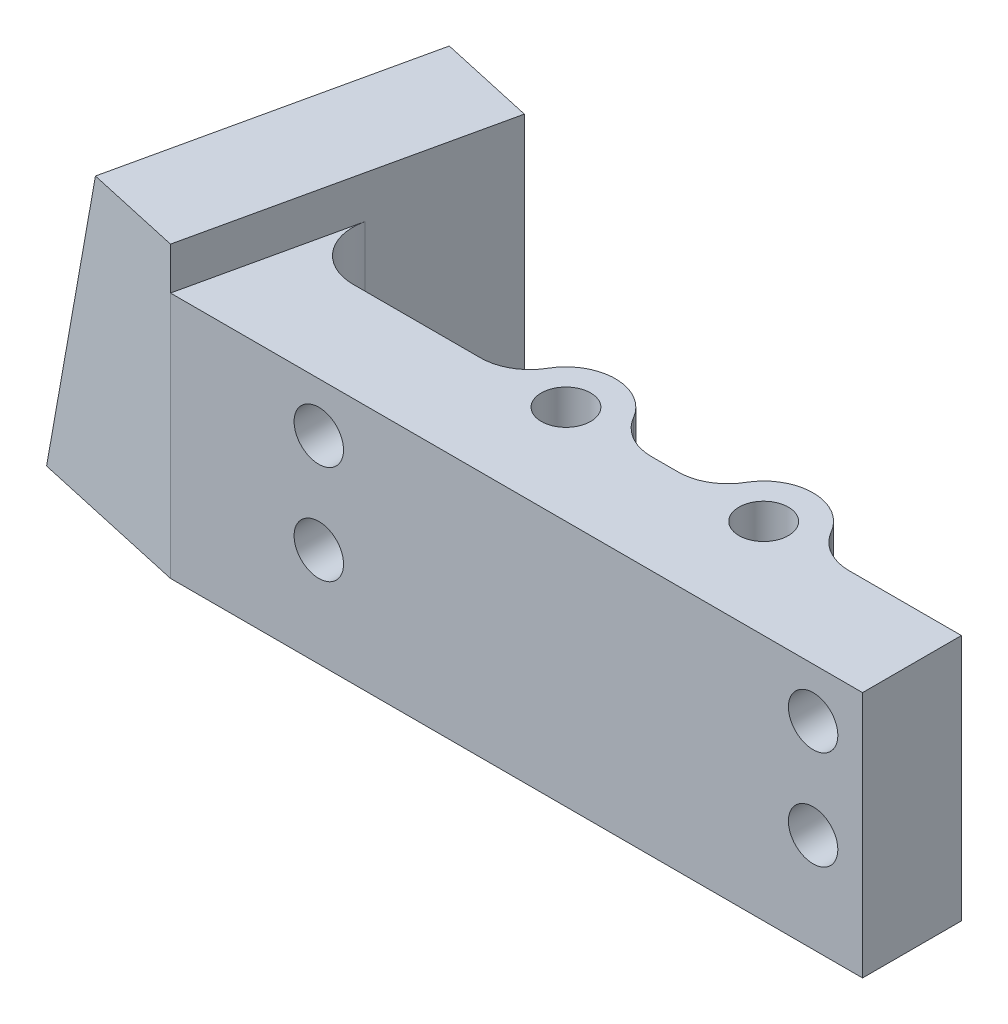
ISO-10303-21;
HEADER;
FILE_DESCRIPTION(('STEP AP214'),'2;1');
FILE_NAME('part.step','',(''),(''),'','','');
FILE_SCHEMA(('AUTOMOTIVE_DESIGN { 1 0 10303 214 1 1 1 1 }'));
ENDSEC;
DATA;
#1=APPLICATION_CONTEXT('core data for automotive mechanical design processes');
#2=APPLICATION_PROTOCOL_DEFINITION('international standard','automotive_design',2000,#1);
#3=PRODUCT_CONTEXT('',#1,'mechanical');
#4=PRODUCT('Part','Part','',(#3));
#5=PRODUCT_RELATED_PRODUCT_CATEGORY('part','',(#4));
#6=PRODUCT_DEFINITION_FORMATION('','',#4);
#7=PRODUCT_DEFINITION_CONTEXT('part definition',#1,'design');
#8=PRODUCT_DEFINITION('design','',#6,#7);
#9=PRODUCT_DEFINITION_SHAPE('','',#8);
#10=(LENGTH_UNIT() NAMED_UNIT(*) SI_UNIT(.MILLI.,.METRE.));
#11=(NAMED_UNIT(*) PLANE_ANGLE_UNIT() SI_UNIT($,.RADIAN.));
#12=(NAMED_UNIT(*) SI_UNIT($,.STERADIAN.) SOLID_ANGLE_UNIT());
#13=UNCERTAINTY_MEASURE_WITH_UNIT(LENGTH_MEASURE(1.E-05),#10,'distance_accuracy_value','');
#14=(GEOMETRIC_REPRESENTATION_CONTEXT(3) GLOBAL_UNCERTAINTY_ASSIGNED_CONTEXT((#13)) GLOBAL_UNIT_ASSIGNED_CONTEXT((#10,
#11,#12)) REPRESENTATION_CONTEXT('',''));
#15=CARTESIAN_POINT('',(0.,0.,0.));
#16=DIRECTION('',(0.,0.,1.));
#17=DIRECTION('',(1.,0.,0.));
#18=AXIS2_PLACEMENT_3D('',#15,#16,#17);
#19=CARTESIAN_POINT('',(44.45,31.75,9.63692465682551));
#20=DIRECTION('',(0.,0.,-1.));
#21=DIRECTION('',(-1.,0.,0.));
#22=AXIS2_PLACEMENT_3D('',#19,#20,#21);
#23=PLANE('',#22);
#24=DIRECTION('',(1.,0.,0.));
#25=VECTOR('',#24,1.);
#26=CARTESIAN_POINT('',(44.45,0.,9.63692465682551));
#27=LINE('',#26,#25);
#28=CARTESIAN_POINT('',(-44.45,0.,9.6369246568255));
#29=VERTEX_POINT('',#28);
#30=CARTESIAN_POINT('',(44.45,0.,9.63692465682551));
#31=VERTEX_POINT('',#30);
#32=EDGE_CURVE('E154',#29,#31,#27,.T.);
#33=ORIENTED_EDGE('',*,*,#32,.T.);
#34=DIRECTION('',(0.,-1.,0.));
#35=VECTOR('',#34,1.);
#36=CARTESIAN_POINT('',(44.45,31.75,9.63692465682551));
#37=LINE('',#36,#35);
#38=CARTESIAN_POINT('',(44.45,31.75,9.63692465682551));
#39=VERTEX_POINT('',#38);
#40=EDGE_CURVE('E142',#39,#31,#37,.T.);
#41=ORIENTED_EDGE('',*,*,#40,.F.);
#42=DIRECTION('',(1.,0.,0.));
#43=VECTOR('',#42,1.);
#44=CARTESIAN_POINT('',(44.45,31.75,9.63692465682551));
#45=LINE('',#44,#43);
#46=CARTESIAN_POINT('',(-44.45,31.75,9.6369246568255));
#47=VERTEX_POINT('',#46);
#48=EDGE_CURVE('E85',#47,#39,#45,.T.);
#49=ORIENTED_EDGE('',*,*,#48,.F.);
#50=DIRECTION('',(0.,-1.,0.));
#51=VECTOR('',#50,1.);
#52=CARTESIAN_POINT('',(-44.45,31.75,9.6369246568255));
#53=LINE('',#52,#51);
#54=EDGE_CURVE('E126',#47,#29,#53,.T.);
#55=ORIENTED_EDGE('',*,*,#54,.T.);
#56=EDGE_LOOP('',(#33,#41,#49,#55));
#57=FACE_BOUND('',#56,.T.);
#58=CARTESIAN_POINT('',(-25.4,12.7,9.63692465682551));
#59=DIRECTION('',(0.,0.,1.));
#60=DIRECTION('',(1.,0.,0.));
#61=AXIS2_PLACEMENT_3D('',#58,#59,#60);
#62=CIRCLE('',#61,3.17499999999999);
#63=CARTESIAN_POINT('',(-22.225,12.7,9.63692465682551));
#64=VERTEX_POINT('',#63);
#65=EDGE_CURVE('E420',#64,#64,#62,.T.);
#66=ORIENTED_EDGE('',*,*,#65,.F.);
#67=EDGE_LOOP('',(#66));
#68=FACE_BOUND('',#67,.T.);
#69=CARTESIAN_POINT('',(-25.4,25.4,9.63692465682551));
#70=DIRECTION('',(0.,0.,1.));
#71=DIRECTION('',(1.,0.,0.));
#72=AXIS2_PLACEMENT_3D('',#69,#70,#71);
#73=CIRCLE('',#72,3.17499999999999);
#74=CARTESIAN_POINT('',(-22.225,25.4,9.63692465682551));
#75=VERTEX_POINT('',#74);
#76=EDGE_CURVE('E414',#75,#75,#73,.T.);
#77=ORIENTED_EDGE('',*,*,#76,.F.);
#78=EDGE_LOOP('',(#77));
#79=FACE_BOUND('',#78,.T.);
#80=CARTESIAN_POINT('',(38.1,12.7,9.63692465682551));
#81=DIRECTION('',(0.,0.,1.));
#82=DIRECTION('',(1.,0.,0.));
#83=AXIS2_PLACEMENT_3D('',#80,#81,#82);
#84=CIRCLE('',#83,3.17499999999999);
#85=CARTESIAN_POINT('',(41.275,12.7,9.63692465682551));
#86=VERTEX_POINT('',#85);
#87=EDGE_CURVE('E408',#86,#86,#84,.T.);
#88=ORIENTED_EDGE('',*,*,#87,.F.);
#89=EDGE_LOOP('',(#88));
#90=FACE_BOUND('',#89,.T.);
#91=CARTESIAN_POINT('',(38.1,25.4,9.63692465682551));
#92=DIRECTION('',(0.,0.,1.));
#93=DIRECTION('',(1.,0.,0.));
#94=AXIS2_PLACEMENT_3D('',#91,#92,#93);
#95=CIRCLE('',#94,3.17499999999999);
#96=CARTESIAN_POINT('',(41.275,25.4,9.63692465682551));
#97=VERTEX_POINT('',#96);
#98=EDGE_CURVE('E396',#97,#97,#95,.T.);
#99=ORIENTED_EDGE('',*,*,#98,.F.);
#100=EDGE_LOOP('',(#99));
#101=FACE_BOUND('',#100,.T.);
#102=ADVANCED_FACE('F37',(#57,#68,#79,#90,#101),#23,.F.);
#103=CARTESIAN_POINT('',(-36.1849495571092,31.75,-27.5558023361831));
#104=DIRECTION('',(-0.290636536065826,0.,0.956833529880542));
#105=DIRECTION('',(0.956833529880542,0.,0.290636536065826));
#106=AXIS2_PLACEMENT_3D('',#103,#104,#105);
#107=PLANE('',#106);
#108=DIRECTION('',(-0.956833529880542,0.,-0.290636536065826));
#109=VECTOR('',#108,1.);
#110=CARTESIAN_POINT('',(-36.1849495571092,6.35,-27.5558023361831));
#111=LINE('',#110,#109);
#112=CARTESIAN_POINT('',(44.45,6.35,-3.06307534317449));
#113=VERTEX_POINT('',#112);
#114=CARTESIAN_POINT('',(-36.1849495571092,6.35,-27.5558023361831));
#115=VERTEX_POINT('',#114);
#116=EDGE_CURVE('E276',#113,#115,#111,.T.);
#117=ORIENTED_EDGE('',*,*,#116,.F.);
#118=DIRECTION('',(0.,-1.,0.));
#119=VECTOR('',#118,1.);
#120=CARTESIAN_POINT('',(44.45,31.75,-3.06307534317449));
#121=LINE('',#120,#119);
#122=CARTESIAN_POINT('',(44.45,0.,-3.06307534317449));
#123=VERTEX_POINT('',#122);
#124=EDGE_CURVE('E164',#113,#123,#121,.T.);
#125=ORIENTED_EDGE('',*,*,#124,.T.);
#126=DIRECTION('',(-0.956833529880542,0.,-0.290636536065826));
#127=VECTOR('',#126,1.);
#128=CARTESIAN_POINT('',(-36.1849495571092,0.,-27.5558023361831));
#129=LINE('',#128,#127);
#130=CARTESIAN_POINT('',(-36.1849495571092,0.,-27.5558023361831));
#131=VERTEX_POINT('',#130);
#132=EDGE_CURVE('E147',#123,#131,#129,.T.);
#133=ORIENTED_EDGE('',*,*,#132,.T.);
#134=DIRECTION('',(0.,-1.,0.));
#135=VECTOR('',#134,1.);
#136=CARTESIAN_POINT('',(-36.1849495571092,31.75,-27.5558023361831));
#137=LINE('',#136,#135);
#138=EDGE_CURVE('E41',#115,#131,#137,.T.);
#139=ORIENTED_EDGE('',*,*,#138,.F.);
#140=EDGE_LOOP('',(#117,#125,#133,#139));
#141=FACE_BOUND('',#140,.T.);
#142=ADVANCED_FACE('F356',(#141),#107,.F.);
#143=CARTESIAN_POINT('',(4.13252522144541,37.19322,-18.5963634965043));
#144=DIRECTION('',(0.216930457818657,0.,-0.976187060183953));
#145=DIRECTION('',(-0.976187060183953,0.,-0.216930457818657));
#146=AXIS2_PLACEMENT_3D('',#143,#144,#145);
#147=PLANE('',#146);
#148=DIRECTION('',(0.976187060183953,0.,0.216930457818657));
#149=VECTOR('',#148,1.);
#150=CARTESIAN_POINT('',(4.13252522144541,0.,-18.5963634965043));
#151=LINE('',#150,#149);
#152=CARTESIAN_POINT('',(-56.6516603161475,0.,-32.1039602826361));
#153=VERTEX_POINT('',#152);
#154=EDGE_CURVE('E123',#153,#131,#151,.T.);
#155=ORIENTED_EDGE('',*,*,#154,.F.);
#156=DIRECTION('',(-0.211784535971522,-0.976182545779719,-0.047063230215894));
#157=VECTOR('',#156,1.);
#158=CARTESIAN_POINT('',(-48.5825252214454,37.19322,-30.31081915048));
#159=LINE('',#158,#157);
#160=CARTESIAN_POINT('',(-48.5825252214454,37.19322,-30.31081915048));
#161=VERTEX_POINT('',#160);
#162=EDGE_CURVE('E11',#161,#153,#159,.T.);
#163=ORIENTED_EDGE('',*,*,#162,.F.);
#164=DIRECTION('',(0.976187060183953,0.,0.216930457818657));
#165=VECTOR('',#164,1.);
#166=CARTESIAN_POINT('',(4.13252522144541,37.19322,-18.5963634965043));
#167=LINE('',#166,#165);
#168=CARTESIAN_POINT('',(-36.1849495571092,37.19322,-27.5558023361831));
#169=VERTEX_POINT('',#168);
#170=EDGE_CURVE('E113',#161,#169,#167,.T.);
#171=ORIENTED_EDGE('',*,*,#170,.T.);
#172=DIRECTION('',(0.,-1.,0.));
#173=VECTOR('',#172,1.);
#174=CARTESIAN_POINT('',(-36.1849495571092,37.19322,-27.5558023361831));
#175=LINE('',#174,#173);
#176=EDGE_CURVE('E57',#169,#115,#175,.T.);
#177=ORIENTED_EDGE('',*,*,#176,.T.);
#178=ORIENTED_EDGE('',*,*,#138,.T.);
#179=EDGE_LOOP('',(#155,#163,#171,#177,#178));
#180=FACE_BOUND('',#179,.T.);
#181=ADVANCED_FACE('F167',(#180),#147,.T.);
#182=CARTESIAN_POINT('',(-52.7150504428908,37.19322,-11.7144556539757));
#183=DIRECTION('',(-0.952936769567591,0.216950771639621,-0.211763726570576));
#184=DIRECTION('',(-0.221985198130334,-0.975050035542298,0.));
#185=AXIS2_PLACEMENT_3D('',#182,#183,#184);
#186=PLANE('',#185);
#187=CARTESIAN_POINT('',(-56.8148990606069,30.9944608342988,0.384268498489547));
#188=DIRECTION('',(-0.952936769567591,0.216950771639622,-0.211763726570576));
#189=DIRECTION('',(-0.221985198130334,-0.975050035542298,0.));
#190=AXIS2_PLACEMENT_3D('',#187,#188,#189);
#191=CIRCLE('',#190,2.5527);
#192=CARTESIAN_POINT('',(-57.3815606758742,28.50545060857,0.384268498489547));
#193=VERTEX_POINT('',#192);
#194=EDGE_CURVE('E383',#193,#193,#191,.T.);
#195=ORIENTED_EDGE('',*,*,#194,.F.);
#196=EDGE_LOOP('',(#195));
#197=FACE_BOUND('',#196,.T.);
#198=CARTESIAN_POINT('',(-53.3384514390064,24.7957016685976,-21.6103404259697));
#199=DIRECTION('',(-0.952936769567591,0.216950771639622,-0.211763726570576));
#200=DIRECTION('',(-0.221985198130334,-0.975050035542298,0.));
#201=AXIS2_PLACEMENT_3D('',#198,#199,#200);
#202=CIRCLE('',#201,2.5527);
#203=CARTESIAN_POINT('',(-53.9051130542737,22.3066914428688,-21.6103404259697));
#204=VERTEX_POINT('',#203);
#205=EDGE_CURVE('E387',#204,#204,#202,.T.);
#206=ORIENTED_EDGE('',*,*,#205,.F.);
#207=EDGE_LOOP('',(#206));
#208=FACE_BOUND('',#207,.T.);
#209=CARTESIAN_POINT('',(-56.0282593200318,12.3975183314024,-22.2080755106421));
#210=DIRECTION('',(-0.952936769567591,0.216950771639622,-0.211763726570576));
#211=DIRECTION('',(-0.221985198130334,-0.975050035542298,0.));
#212=AXIS2_PLACEMENT_3D('',#209,#210,#211);
#213=CIRCLE('',#212,2.5527);
#214=CARTESIAN_POINT('',(-56.5949209352992,9.90850810567361,-22.2080755106421));
#215=VERTEX_POINT('',#214);
#216=EDGE_CURVE('E391',#215,#215,#213,.T.);
#217=ORIENTED_EDGE('',*,*,#216,.F.);
#218=EDGE_LOOP('',(#217));
#219=FACE_BOUND('',#218,.T.);
#220=CARTESIAN_POINT('',(-62.1943948890484,6.19875916570122,-0.811060077324629));
#221=DIRECTION('',(-0.952936769567591,0.216950771639622,-0.211763726570576));
#222=DIRECTION('',(-0.221985198130334,-0.975050035542298,0.));
#223=AXIS2_PLACEMENT_3D('',#220,#221,#222);
#224=CIRCLE('',#223,2.5527);
#225=CARTESIAN_POINT('',(-62.7610565043157,3.70974893997239,-0.811060077324629));
#226=VERTEX_POINT('',#225);
#227=EDGE_CURVE('E394',#226,#226,#224,.T.);
#228=ORIENTED_EDGE('',*,*,#227,.F.);
#229=EDGE_LOOP('',(#228));
#230=FACE_BOUND('',#229,.T.);
#231=DIRECTION('',(0.216930457818656,0.,-0.976187060183953));
#232=VECTOR('',#231,1.);
#233=CARTESIAN_POINT('',(-60.7841855375928,0.,-13.5075967861317));
#234=LINE('',#233,#232);
#235=CARTESIAN_POINT('',(-64.9167107590383,0.,5.08876671037256));
#236=VERTEX_POINT('',#235);
#237=EDGE_CURVE('E101',#236,#153,#234,.T.);
#238=ORIENTED_EDGE('',*,*,#237,.F.);
#239=DIRECTION('',(-0.211784535971522,-0.976182545779719,-0.0470632302158938));
#240=VECTOR('',#239,1.);
#241=CARTESIAN_POINT('',(-54.3664027890468,48.6297379818664,7.43327959259287));
#242=LINE('',#241,#240);
#243=CARTESIAN_POINT('',(-56.8475756643362,37.19322,6.88190784252857));
#244=VERTEX_POINT('',#243);
#245=EDGE_CURVE('E48',#244,#236,#242,.T.);
#246=ORIENTED_EDGE('',*,*,#245,.F.);
#247=DIRECTION('',(0.216930457818656,0.,-0.976187060183953));
#248=VECTOR('',#247,1.);
#249=CARTESIAN_POINT('',(-52.7150504428908,37.19322,-11.7144556539757));
#250=LINE('',#249,#248);
#251=EDGE_CURVE('E99',#244,#161,#250,.T.);
#252=ORIENTED_EDGE('',*,*,#251,.T.);
#253=ORIENTED_EDGE('',*,*,#162,.T.);
#254=EDGE_LOOP('',(#238,#246,#252,#253));
#255=FACE_BOUND('',#254,.T.);
#256=ADVANCED_FACE('F39',(#197,#208,#219,#230,#255),#186,.T.);
#257=CARTESIAN_POINT('',(-4.1325252214454,37.19322,18.5963634965043));
#258=DIRECTION('',(-0.216930457818656,0.,0.976187060183953));
#259=DIRECTION('',(0.976187060183953,0.,0.216930457818656));
#260=AXIS2_PLACEMENT_3D('',#257,#258,#259);
#261=PLANE('',#260);
#262=DIRECTION('',(-0.976187060183953,0.,-0.216930457818656));
#263=VECTOR('',#262,1.);
#264=CARTESIAN_POINT('',(-4.1325252214454,0.,18.5963634965043));
#265=LINE('',#264,#263);
#266=EDGE_CURVE('E127',#29,#236,#265,.T.);
#267=ORIENTED_EDGE('',*,*,#266,.F.);
#268=ORIENTED_EDGE('',*,*,#54,.F.);
#269=DIRECTION('',(0.,-1.,0.));
#270=VECTOR('',#269,1.);
#271=CARTESIAN_POINT('',(-44.45,37.19322,9.6369246568255));
#272=LINE('',#271,#270);
#273=CARTESIAN_POINT('',(-44.45,37.19322,9.6369246568255));
#274=VERTEX_POINT('',#273);
#275=EDGE_CURVE('E105',#274,#47,#272,.T.);
#276=ORIENTED_EDGE('',*,*,#275,.F.);
#277=DIRECTION('',(-0.976187060183953,0.,-0.216930457818656));
#278=VECTOR('',#277,1.);
#279=CARTESIAN_POINT('',(-4.1325252214454,37.19322,18.5963634965043));
#280=LINE('',#279,#278);
#281=EDGE_CURVE('E112',#274,#244,#280,.T.);
#282=ORIENTED_EDGE('',*,*,#281,.T.);
#283=ORIENTED_EDGE('',*,*,#245,.T.);
#284=EDGE_LOOP('',(#267,#268,#276,#282,#283));
#285=FACE_BOUND('',#284,.T.);
#286=ADVANCED_FACE('F115',(#285),#261,.T.);
#287=CARTESIAN_POINT('',(-40.3174747785546,37.19322,-8.9594388396788));
#288=DIRECTION('',(0.976187060183953,0.,0.216930457818656));
#289=DIRECTION('',(0.216930457818656,0.,-0.976187060183953));
#290=AXIS2_PLACEMENT_3D('',#287,#288,#289);
#291=PLANE('',#290);
#292=DIRECTION('',(-0.216930457818656,0.,0.976187060183953));
#293=VECTOR('',#292,1.);
#294=CARTESIAN_POINT('',(-44.45,31.75,9.6369246568255));
#295=LINE('',#294,#293);
#296=CARTESIAN_POINT('',(-39.9105536873003,31.75,-10.790583750323));
#297=VERTEX_POINT('',#296);
#298=EDGE_CURVE('E137',#297,#47,#295,.T.);
#299=ORIENTED_EDGE('',*,*,#298,.F.);
#300=DIRECTION('',(0.,1.,0.));
#301=VECTOR('',#300,1.);
#302=CARTESIAN_POINT('',(-39.9105536873003,6.35,-10.790583750323));
#303=LINE('',#302,#301);
#304=CARTESIAN_POINT('',(-39.9105536873003,6.35,-10.790583750323));
#305=VERTEX_POINT('',#304);
#306=EDGE_CURVE('E281',#305,#297,#303,.T.);
#307=ORIENTED_EDGE('',*,*,#306,.F.);
#308=DIRECTION('',(-0.216930457818656,0.,0.976187060183953));
#309=VECTOR('',#308,1.);
#310=CARTESIAN_POINT('',(-36.1849495571092,6.35,-27.5558023361831));
#311=LINE('',#310,#309);
#312=EDGE_CURVE('E426',#115,#305,#311,.T.);
#313=ORIENTED_EDGE('',*,*,#312,.F.);
#314=ORIENTED_EDGE('',*,*,#176,.F.);
#315=DIRECTION('',(-0.216930457818656,0.,0.976187060183953));
#316=VECTOR('',#315,1.);
#317=CARTESIAN_POINT('',(-40.3174747785546,37.19322,-8.9594388396788));
#318=LINE('',#317,#316);
#319=EDGE_CURVE('E118',#169,#274,#318,.T.);
#320=ORIENTED_EDGE('',*,*,#319,.T.);
#321=ORIENTED_EDGE('',*,*,#275,.T.);
#322=EDGE_LOOP('',(#299,#307,#313,#314,#320,#321));
#323=FACE_BOUND('',#322,.T.);
#324=ADVANCED_FACE('F170',(#323),#291,.T.);
#325=CARTESIAN_POINT('',(0.,37.19322,0.));
#326=DIRECTION('',(0.,1.,0.));
#327=DIRECTION('',(0.,0.,1.));
#328=AXIS2_PLACEMENT_3D('',#325,#326,#327);
#329=PLANE('',#328);
#330=ORIENTED_EDGE('',*,*,#170,.F.);
#331=ORIENTED_EDGE('',*,*,#251,.F.);
#332=ORIENTED_EDGE('',*,*,#281,.F.);
#333=ORIENTED_EDGE('',*,*,#319,.F.);
#334=EDGE_LOOP('',(#330,#331,#332,#333));
#335=FACE_BOUND('',#334,.T.);
#336=ADVANCED_FACE('F110',(#335),#329,.T.);
#337=CARTESIAN_POINT('',(0.,0.,0.));
#338=DIRECTION('',(0.,1.,0.));
#339=DIRECTION('',(0.,0.,1.));
#340=AXIS2_PLACEMENT_3D('',#337,#338,#339);
#341=PLANE('',#340);
#342=CARTESIAN_POINT('',(-6.35,0.,-3.06307534317448));
#343=DIRECTION('',(0.,1.,0.));
#344=DIRECTION('',(0.,0.,1.));
#345=AXIS2_PLACEMENT_3D('',#342,#343,#344);
#346=CIRCLE('',#345,3.17499999999999);
#347=CARTESIAN_POINT('',(-6.35,0.,0.111924656825505));
#348=VERTEX_POINT('',#347);
#349=EDGE_CURVE('E331',#348,#348,#346,.T.);
#350=ORIENTED_EDGE('',*,*,#349,.T.);
#351=EDGE_LOOP('',(#350));
#352=FACE_BOUND('',#351,.T.);
#353=CARTESIAN_POINT('',(19.05,0.,-3.06307534317449));
#354=DIRECTION('',(0.,1.,0.));
#355=DIRECTION('',(0.,0.,1.));
#356=AXIS2_PLACEMENT_3D('',#353,#354,#355);
#357=CIRCLE('',#356,3.17499999999999);
#358=CARTESIAN_POINT('',(19.05,0.,0.111924656825501));
#359=VERTEX_POINT('',#358);
#360=EDGE_CURVE('E151',#359,#359,#357,.T.);
#361=ORIENTED_EDGE('',*,*,#360,.T.);
#362=EDGE_LOOP('',(#361));
#363=FACE_BOUND('',#362,.T.);
#364=ORIENTED_EDGE('',*,*,#154,.T.);
#365=ORIENTED_EDGE('',*,*,#132,.F.);
#366=DIRECTION('',(0.,0.,-1.));
#367=VECTOR('',#366,1.);
#368=CARTESIAN_POINT('',(44.45,0.,-3.06307534317449));
#369=LINE('',#368,#367);
#370=EDGE_CURVE('E156',#31,#123,#369,.T.);
#371=ORIENTED_EDGE('',*,*,#370,.F.);
#372=ORIENTED_EDGE('',*,*,#32,.F.);
#373=ORIENTED_EDGE('',*,*,#266,.T.);
#374=ORIENTED_EDGE('',*,*,#237,.T.);
#375=EDGE_LOOP('',(#364,#365,#371,#372,#373,#374));
#376=FACE_BOUND('',#375,.T.);
#377=ADVANCED_FACE('F340',(#352,#363,#376),#341,.F.);
#378=CARTESIAN_POINT('',(44.45,31.75,-3.06307534317449));
#379=DIRECTION('',(-1.,0.,0.));
#380=DIRECTION('',(0.,0.,1.));
#381=AXIS2_PLACEMENT_3D('',#378,#379,#380);
#382=PLANE('',#381);
#383=ORIENTED_EDGE('',*,*,#370,.T.);
#384=ORIENTED_EDGE('',*,*,#124,.F.);
#385=CARTESIAN_POINT('',(44.45,31.75,-3.06307534317449));
#386=VERTEX_POINT('',#385);
#387=EDGE_CURVE('E161',#386,#113,#121,.T.);
#388=ORIENTED_EDGE('',*,*,#387,.F.);
#389=DIRECTION('',(0.,0.,-1.));
#390=VECTOR('',#389,1.);
#391=CARTESIAN_POINT('',(44.45,31.75,-3.06307534317449));
#392=LINE('',#391,#390);
#393=EDGE_CURVE('E136',#39,#386,#392,.T.);
#394=ORIENTED_EDGE('',*,*,#393,.F.);
#395=ORIENTED_EDGE('',*,*,#40,.T.);
#396=EDGE_LOOP('',(#383,#384,#388,#394,#395));
#397=FACE_BOUND('',#396,.T.);
#398=ADVANCED_FACE('F180',(#397),#382,.F.);
#399=CARTESIAN_POINT('',(0.,31.75,0.));
#400=DIRECTION('',(0.,-1.,0.));
#401=DIRECTION('',(0.,0.,-1.));
#402=AXIS2_PLACEMENT_3D('',#399,#400,#401);
#403=PLANE('',#402);
#404=CARTESIAN_POINT('',(-6.35,31.75,-3.06307534317448));
#405=DIRECTION('',(0.,1.,0.));
#406=DIRECTION('',(0.,0.,1.));
#407=AXIS2_PLACEMENT_3D('',#404,#405,#406);
#408=CIRCLE('',#407,3.17499999999999);
#409=CARTESIAN_POINT('',(-6.35,31.75,0.111924656825503));
#410=VERTEX_POINT('',#409);
#411=EDGE_CURVE('E269',#410,#410,#408,.T.);
#412=ORIENTED_EDGE('',*,*,#411,.F.);
#413=EDGE_LOOP('',(#412));
#414=FACE_BOUND('',#413,.T.);
#415=CARTESIAN_POINT('',(19.05,31.75,-3.06307534317449));
#416=DIRECTION('',(0.,1.,0.));
#417=DIRECTION('',(0.,0.,1.));
#418=AXIS2_PLACEMENT_3D('',#415,#416,#417);
#419=CIRCLE('',#418,3.17499999999999);
#420=CARTESIAN_POINT('',(19.05,31.75,0.111924656825499));
#421=VERTEX_POINT('',#420);
#422=EDGE_CURVE('E333',#421,#421,#419,.T.);
#423=ORIENTED_EDGE('',*,*,#422,.F.);
#424=EDGE_LOOP('',(#423));
#425=FACE_BOUND('',#424,.T.);
#426=ORIENTED_EDGE('',*,*,#393,.T.);
#427=DIRECTION('',(1.,0.,0.));
#428=VECTOR('',#427,1.);
#429=CARTESIAN_POINT('',(30.0485226280624,31.75,-3.06307534317448));
#430=LINE('',#429,#428);
#431=CARTESIAN_POINT('',(30.0485226280624,31.75,-3.06307534317448));
#432=VERTEX_POINT('',#431);
#433=EDGE_CURVE('E188',#432,#386,#430,.T.);
#434=ORIENTED_EDGE('',*,*,#433,.F.);
#435=CARTESIAN_POINT('',(30.0485226280624,31.75,-9.41307534317448));
#436=DIRECTION('',(0.,1.,0.));
#437=DIRECTION('',(0.,0.,-1.));
#438=AXIS2_PLACEMENT_3D('',#435,#436,#437);
#439=CIRCLE('',#438,6.35);
#440=CARTESIAN_POINT('',(24.5492613140312,31.75,-6.23807534317448));
#441=VERTEX_POINT('',#440);
#442=EDGE_CURVE('E268',#441,#432,#439,.T.);
#443=ORIENTED_EDGE('',*,*,#442,.F.);
#444=CARTESIAN_POINT('',(19.05,31.75,-3.06307534317449));
#445=DIRECTION('',(0.,-1.,0.));
#446=DIRECTION('',(0.,0.,1.));
#447=AXIS2_PLACEMENT_3D('',#444,#445,#446);
#448=CIRCLE('',#447,6.34999999999999);
#449=CARTESIAN_POINT('',(13.5507386859688,31.75,-6.23807534317448));
#450=VERTEX_POINT('',#449);
#451=EDGE_CURVE('E312',#450,#441,#448,.T.);
#452=ORIENTED_EDGE('',*,*,#451,.F.);
#453=CARTESIAN_POINT('',(8.05147737193764,31.75,-9.41307534317448));
#454=DIRECTION('',(0.,1.,0.));
#455=DIRECTION('',(0.,0.,1.));
#456=AXIS2_PLACEMENT_3D('',#453,#454,#455);
#457=CIRCLE('',#456,6.35);
#458=CARTESIAN_POINT('',(8.05147737193764,31.75,-3.06307534317448));
#459=VERTEX_POINT('',#458);
#460=EDGE_CURVE('E309',#459,#450,#457,.T.);
#461=ORIENTED_EDGE('',*,*,#460,.F.);
#462=DIRECTION('',(1.,0.,0.));
#463=VECTOR('',#462,1.);
#464=CARTESIAN_POINT('',(4.64852262806235,31.75,-3.06307534317448));
#465=LINE('',#464,#463);
#466=CARTESIAN_POINT('',(4.64852262806235,31.75,-3.06307534317448));
#467=VERTEX_POINT('',#466);
#468=EDGE_CURVE('E306',#467,#459,#465,.T.);
#469=ORIENTED_EDGE('',*,*,#468,.F.);
#470=CARTESIAN_POINT('',(4.64852262806235,31.75,-9.41307534317448));
#471=DIRECTION('',(0.,1.,0.));
#472=DIRECTION('',(0.,0.,-1.));
#473=AXIS2_PLACEMENT_3D('',#470,#471,#472);
#474=CIRCLE('',#473,6.35);
#475=CARTESIAN_POINT('',(-0.850738685968831,31.75,-6.23807534317448));
#476=VERTEX_POINT('',#475);
#477=EDGE_CURVE('E303',#476,#467,#474,.T.);
#478=ORIENTED_EDGE('',*,*,#477,.F.);
#479=CARTESIAN_POINT('',(-6.35,31.75,-3.06307534317448));
#480=DIRECTION('',(0.,-1.,0.));
#481=DIRECTION('',(0.,0.,1.));
#482=AXIS2_PLACEMENT_3D('',#479,#480,#481);
#483=CIRCLE('',#482,6.34999999999999);
#484=CARTESIAN_POINT('',(-11.8492613140312,31.75,-6.23807534317448));
#485=VERTEX_POINT('',#484);
#486=EDGE_CURVE('E300',#485,#476,#483,.T.);
#487=ORIENTED_EDGE('',*,*,#486,.F.);
#488=CARTESIAN_POINT('',(-17.3485226280624,31.75,-9.41307534317448));
#489=DIRECTION('',(0.,1.,0.));
#490=DIRECTION('',(0.,0.,1.));
#491=AXIS2_PLACEMENT_3D('',#488,#489,#490);
#492=CIRCLE('',#491,6.35);
#493=CARTESIAN_POINT('',(-17.3485226280624,31.75,-3.06307534317448));
#494=VERTEX_POINT('',#493);
#495=EDGE_CURVE('E297',#494,#485,#492,.T.);
#496=ORIENTED_EDGE('',*,*,#495,.F.);
#497=DIRECTION('',(1.,0.,0.));
#498=VECTOR('',#497,1.);
#499=CARTESIAN_POINT('',(-33.7117658551322,31.75,-3.06307534317448));
#500=LINE('',#499,#498);
#501=CARTESIAN_POINT('',(-33.7117658551322,31.75,-3.06307534317448));
#502=VERTEX_POINT('',#501);
#503=EDGE_CURVE('E294',#502,#494,#500,.T.);
#504=ORIENTED_EDGE('',*,*,#503,.F.);
#505=CARTESIAN_POINT('',(-33.7117658551322,31.75,-9.41307534317449));
#506=DIRECTION('',(0.,1.,0.));
#507=DIRECTION('',(0.,0.,1.));
#508=AXIS2_PLACEMENT_3D('',#505,#506,#507);
#509=CIRCLE('',#508,6.35);
#510=EDGE_CURVE('E290',#297,#502,#509,.T.);
#511=ORIENTED_EDGE('',*,*,#510,.F.);
#512=ORIENTED_EDGE('',*,*,#298,.T.);
#513=ORIENTED_EDGE('',*,*,#48,.T.);
#514=EDGE_LOOP('',(#426,#434,#443,#452,#461,#469,#478,#487,#496,#504,#511,#512,#513));
#515=FACE_BOUND('',#514,.T.);
#516=ADVANCED_FACE('F184',(#414,#425,#515),#403,.F.);
#517=CARTESIAN_POINT('',(19.05,31.75,-3.06307534317449));
#518=DIRECTION('',(0.,1.,0.));
#519=DIRECTION('',(0.,0.,1.));
#520=AXIS2_PLACEMENT_3D('',#517,#518,#519);
#521=CYLINDRICAL_SURFACE('',#520,3.17499999999999);
#522=ORIENTED_EDGE('',*,*,#360,.F.);
#523=EDGE_LOOP('',(#522));
#524=FACE_BOUND('',#523,.T.);
#525=ORIENTED_EDGE('',*,*,#422,.T.);
#526=EDGE_LOOP('',(#525));
#527=FACE_BOUND('',#526,.T.);
#528=ADVANCED_FACE('F343',(#524,#527),#521,.F.);
#529=CARTESIAN_POINT('',(-6.35,31.75,-3.06307534317448));
#530=DIRECTION('',(0.,1.,0.));
#531=DIRECTION('',(0.,0.,1.));
#532=AXIS2_PLACEMENT_3D('',#529,#530,#531);
#533=CYLINDRICAL_SURFACE('',#532,3.17499999999999);
#534=ORIENTED_EDGE('',*,*,#349,.F.);
#535=EDGE_LOOP('',(#534));
#536=FACE_BOUND('',#535,.T.);
#537=ORIENTED_EDGE('',*,*,#411,.T.);
#538=EDGE_LOOP('',(#537));
#539=FACE_BOUND('',#538,.T.);
#540=ADVANCED_FACE('F345',(#536,#539),#533,.F.);
#541=CARTESIAN_POINT('',(30.0485226280624,6.35,-3.06307534317448));
#542=DIRECTION('',(0.,0.,1.));
#543=DIRECTION('',(1.,0.,0.));
#544=AXIS2_PLACEMENT_3D('',#541,#542,#543);
#545=PLANE('',#544);
#546=CARTESIAN_POINT('',(38.1,25.4,-3.06307534317449));
#547=DIRECTION('',(0.,0.,1.));
#548=DIRECTION('',(1.,0.,0.));
#549=AXIS2_PLACEMENT_3D('',#546,#547,#548);
#550=CIRCLE('',#549,3.17499999999999);
#551=CARTESIAN_POINT('',(41.275,25.4,-3.06307534317449));
#552=VERTEX_POINT('',#551);
#553=EDGE_CURVE('E400',#552,#552,#550,.T.);
#554=ORIENTED_EDGE('',*,*,#553,.T.);
#555=EDGE_LOOP('',(#554));
#556=FACE_BOUND('',#555,.T.);
#557=CARTESIAN_POINT('',(38.1,12.7,-3.06307534317449));
#558=DIRECTION('',(0.,0.,1.));
#559=DIRECTION('',(1.,0.,0.));
#560=AXIS2_PLACEMENT_3D('',#557,#558,#559);
#561=CIRCLE('',#560,3.17499999999999);
#562=CARTESIAN_POINT('',(41.275,12.7,-3.06307534317449));
#563=VERTEX_POINT('',#562);
#564=EDGE_CURVE('E411',#563,#563,#561,.T.);
#565=ORIENTED_EDGE('',*,*,#564,.T.);
#566=EDGE_LOOP('',(#565));
#567=FACE_BOUND('',#566,.T.);
#568=ORIENTED_EDGE('',*,*,#433,.T.);
#569=ORIENTED_EDGE('',*,*,#387,.T.);
#570=DIRECTION('',(1.,0.,0.));
#571=VECTOR('',#570,1.);
#572=CARTESIAN_POINT('',(30.0485226280624,6.35,-3.06307534317448));
#573=LINE('',#572,#571);
#574=CARTESIAN_POINT('',(30.0485226280624,6.35,-3.06307534317448));
#575=VERTEX_POINT('',#574);
#576=EDGE_CURVE('E271',#575,#113,#573,.T.);
#577=ORIENTED_EDGE('',*,*,#576,.F.);
#578=DIRECTION('',(0.,1.,0.));
#579=VECTOR('',#578,1.);
#580=CARTESIAN_POINT('',(30.0485226280624,6.35,-3.06307534317448));
#581=LINE('',#580,#579);
#582=EDGE_CURVE('E227',#575,#432,#581,.T.);
#583=ORIENTED_EDGE('',*,*,#582,.T.);
#584=EDGE_LOOP('',(#568,#569,#577,#583));
#585=FACE_BOUND('',#584,.T.);
#586=ADVANCED_FACE('F272',(#556,#567,#585),#545,.F.);
#587=CARTESIAN_POINT('',(30.0485226280624,6.35,-9.41307534317448));
#588=DIRECTION('',(0.,1.,0.));
#589=DIRECTION('',(0.,0.,1.));
#590=AXIS2_PLACEMENT_3D('',#587,#588,#589);
#591=CYLINDRICAL_SURFACE('',#590,6.35);
#592=ORIENTED_EDGE('',*,*,#442,.T.);
#593=ORIENTED_EDGE('',*,*,#582,.F.);
#594=CARTESIAN_POINT('',(30.0485226280624,6.35,-9.41307534317448));
#595=DIRECTION('',(0.,1.,0.));
#596=DIRECTION('',(0.,0.,-1.));
#597=AXIS2_PLACEMENT_3D('',#594,#595,#596);
#598=CIRCLE('',#597,6.35);
#599=CARTESIAN_POINT('',(24.5492613140312,6.35,-6.23807534317448));
#600=VERTEX_POINT('',#599);
#601=EDGE_CURVE('E267',#600,#575,#598,.T.);
#602=ORIENTED_EDGE('',*,*,#601,.F.);
#603=DIRECTION('',(0.,1.,0.));
#604=VECTOR('',#603,1.);
#605=CARTESIAN_POINT('',(24.5492613140312,6.35,-6.23807534317448));
#606=LINE('',#605,#604);
#607=EDGE_CURVE('E261',#600,#441,#606,.T.);
#608=ORIENTED_EDGE('',*,*,#607,.T.);
#609=EDGE_LOOP('',(#592,#593,#602,#608));
#610=FACE_BOUND('',#609,.T.);
#611=ADVANCED_FACE('F265',(#610),#591,.F.);
#612=CARTESIAN_POINT('',(19.05,6.35,-3.06307534317449));
#613=DIRECTION('',(0.,1.,0.));
#614=DIRECTION('',(0.,0.,1.));
#615=AXIS2_PLACEMENT_3D('',#612,#613,#614);
#616=CYLINDRICAL_SURFACE('',#615,6.34999999999999);
#617=ORIENTED_EDGE('',*,*,#451,.T.);
#618=ORIENTED_EDGE('',*,*,#607,.F.);
#619=CARTESIAN_POINT('',(19.05,6.35,-3.06307534317449));
#620=DIRECTION('',(0.,-1.,0.));
#621=DIRECTION('',(0.,0.,1.));
#622=AXIS2_PLACEMENT_3D('',#619,#620,#621);
#623=CIRCLE('',#622,6.34999999999999);
#624=CARTESIAN_POINT('',(13.5507386859688,6.35,-6.23807534317448));
#625=VERTEX_POINT('',#624);
#626=EDGE_CURVE('E280',#625,#600,#623,.T.);
#627=ORIENTED_EDGE('',*,*,#626,.F.);
#628=DIRECTION('',(0.,1.,0.));
#629=VECTOR('',#628,1.);
#630=CARTESIAN_POINT('',(13.5507386859688,6.35,-6.23807534317448));
#631=LINE('',#630,#629);
#632=EDGE_CURVE('E316',#625,#450,#631,.T.);
#633=ORIENTED_EDGE('',*,*,#632,.T.);
#634=EDGE_LOOP('',(#617,#618,#627,#633));
#635=FACE_BOUND('',#634,.T.);
#636=ADVANCED_FACE('F452',(#635),#616,.T.);
#637=CARTESIAN_POINT('',(8.05147737193764,6.35,-9.41307534317448));
#638=DIRECTION('',(0.,1.,0.));
#639=DIRECTION('',(0.,0.,1.));
#640=AXIS2_PLACEMENT_3D('',#637,#638,#639);
#641=CYLINDRICAL_SURFACE('',#640,6.35);
#642=ORIENTED_EDGE('',*,*,#460,.T.);
#643=ORIENTED_EDGE('',*,*,#632,.F.);
#644=CARTESIAN_POINT('',(8.05147737193764,6.35,-9.41307534317448));
#645=DIRECTION('',(0.,1.,0.));
#646=DIRECTION('',(0.,0.,1.));
#647=AXIS2_PLACEMENT_3D('',#644,#645,#646);
#648=CIRCLE('',#647,6.35);
#649=CARTESIAN_POINT('',(8.05147737193764,6.35,-3.06307534317448));
#650=VERTEX_POINT('',#649);
#651=EDGE_CURVE('E285',#650,#625,#648,.T.);
#652=ORIENTED_EDGE('',*,*,#651,.F.);
#653=DIRECTION('',(0.,1.,0.));
#654=VECTOR('',#653,1.);
#655=CARTESIAN_POINT('',(8.05147737193764,6.35,-3.06307534317448));
#656=LINE('',#655,#654);
#657=EDGE_CURVE('E318',#650,#459,#656,.T.);
#658=ORIENTED_EDGE('',*,*,#657,.T.);
#659=EDGE_LOOP('',(#642,#643,#652,#658));
#660=FACE_BOUND('',#659,.T.);
#661=ADVANCED_FACE('F449',(#660),#641,.F.);
#662=CARTESIAN_POINT('',(4.64852262806235,6.35,-3.06307534317448));
#663=DIRECTION('',(0.,0.,1.));
#664=DIRECTION('',(1.,0.,0.));
#665=AXIS2_PLACEMENT_3D('',#662,#663,#664);
#666=PLANE('',#665);
#667=ORIENTED_EDGE('',*,*,#468,.T.);
#668=ORIENTED_EDGE('',*,*,#657,.F.);
#669=DIRECTION('',(1.,0.,0.));
#670=VECTOR('',#669,1.);
#671=CARTESIAN_POINT('',(4.64852262806235,6.35,-3.06307534317448));
#672=LINE('',#671,#670);
#673=CARTESIAN_POINT('',(4.64852262806235,6.35,-3.06307534317448));
#674=VERTEX_POINT('',#673);
#675=EDGE_CURVE('E444',#674,#650,#672,.T.);
#676=ORIENTED_EDGE('',*,*,#675,.F.);
#677=DIRECTION('',(0.,1.,0.));
#678=VECTOR('',#677,1.);
#679=CARTESIAN_POINT('',(4.64852262806235,6.35,-3.06307534317448));
#680=LINE('',#679,#678);
#681=EDGE_CURVE('E320',#674,#467,#680,.T.);
#682=ORIENTED_EDGE('',*,*,#681,.T.);
#683=EDGE_LOOP('',(#667,#668,#676,#682));
#684=FACE_BOUND('',#683,.T.);
#685=ADVANCED_FACE('F459',(#684),#666,.F.);
#686=CARTESIAN_POINT('',(4.64852262806235,6.35,-9.41307534317448));
#687=DIRECTION('',(0.,1.,0.));
#688=DIRECTION('',(0.,0.,1.));
#689=AXIS2_PLACEMENT_3D('',#686,#687,#688);
#690=CYLINDRICAL_SURFACE('',#689,6.35);
#691=ORIENTED_EDGE('',*,*,#477,.T.);
#692=ORIENTED_EDGE('',*,*,#681,.F.);
#693=CARTESIAN_POINT('',(4.64852262806235,6.35,-9.41307534317448));
#694=DIRECTION('',(0.,1.,0.));
#695=DIRECTION('',(0.,0.,-1.));
#696=AXIS2_PLACEMENT_3D('',#693,#694,#695);
#697=CIRCLE('',#696,6.35);
#698=CARTESIAN_POINT('',(-0.850738685968831,6.35,-6.23807534317448));
#699=VERTEX_POINT('',#698);
#700=EDGE_CURVE('E441',#699,#674,#697,.T.);
#701=ORIENTED_EDGE('',*,*,#700,.F.);
#702=DIRECTION('',(0.,1.,0.));
#703=VECTOR('',#702,1.);
#704=CARTESIAN_POINT('',(-0.850738685968831,6.35,-6.23807534317448));
#705=LINE('',#704,#703);
#706=EDGE_CURVE('E322',#699,#476,#705,.T.);
#707=ORIENTED_EDGE('',*,*,#706,.T.);
#708=EDGE_LOOP('',(#691,#692,#701,#707));
#709=FACE_BOUND('',#708,.T.);
#710=ADVANCED_FACE('F466',(#709),#690,.F.);
#711=CARTESIAN_POINT('',(-6.35,6.35,-3.06307534317448));
#712=DIRECTION('',(0.,1.,0.));
#713=DIRECTION('',(0.,0.,1.));
#714=AXIS2_PLACEMENT_3D('',#711,#712,#713);
#715=CYLINDRICAL_SURFACE('',#714,6.34999999999999);
#716=ORIENTED_EDGE('',*,*,#486,.T.);
#717=ORIENTED_EDGE('',*,*,#706,.F.);
#718=CARTESIAN_POINT('',(-6.35,6.35,-3.06307534317448));
#719=DIRECTION('',(0.,-1.,0.));
#720=DIRECTION('',(0.,0.,1.));
#721=AXIS2_PLACEMENT_3D('',#718,#719,#720);
#722=CIRCLE('',#721,6.34999999999999);
#723=CARTESIAN_POINT('',(-11.8492613140312,6.35,-6.23807534317448));
#724=VERTEX_POINT('',#723);
#725=EDGE_CURVE('E438',#724,#699,#722,.T.);
#726=ORIENTED_EDGE('',*,*,#725,.F.);
#727=DIRECTION('',(0.,1.,0.));
#728=VECTOR('',#727,1.);
#729=CARTESIAN_POINT('',(-11.8492613140312,6.35,-6.23807534317448));
#730=LINE('',#729,#728);
#731=EDGE_CURVE('E324',#724,#485,#730,.T.);
#732=ORIENTED_EDGE('',*,*,#731,.T.);
#733=EDGE_LOOP('',(#716,#717,#726,#732));
#734=FACE_BOUND('',#733,.T.);
#735=ADVANCED_FACE('F470',(#734),#715,.T.);
#736=CARTESIAN_POINT('',(-17.3485226280624,6.35,-9.41307534317448));
#737=DIRECTION('',(0.,1.,0.));
#738=DIRECTION('',(0.,0.,1.));
#739=AXIS2_PLACEMENT_3D('',#736,#737,#738);
#740=CYLINDRICAL_SURFACE('',#739,6.35);
#741=ORIENTED_EDGE('',*,*,#495,.T.);
#742=ORIENTED_EDGE('',*,*,#731,.F.);
#743=CARTESIAN_POINT('',(-17.3485226280624,6.35,-9.41307534317448));
#744=DIRECTION('',(0.,1.,0.));
#745=DIRECTION('',(0.,0.,1.));
#746=AXIS2_PLACEMENT_3D('',#743,#744,#745);
#747=CIRCLE('',#746,6.35);
#748=CARTESIAN_POINT('',(-17.3485226280624,6.35,-3.06307534317448));
#749=VERTEX_POINT('',#748);
#750=EDGE_CURVE('E435',#749,#724,#747,.T.);
#751=ORIENTED_EDGE('',*,*,#750,.F.);
#752=DIRECTION('',(0.,1.,0.));
#753=VECTOR('',#752,1.);
#754=CARTESIAN_POINT('',(-17.3485226280624,6.35,-3.06307534317448));
#755=LINE('',#754,#753);
#756=EDGE_CURVE('E326',#749,#494,#755,.T.);
#757=ORIENTED_EDGE('',*,*,#756,.T.);
#758=EDGE_LOOP('',(#741,#742,#751,#757));
#759=FACE_BOUND('',#758,.T.);
#760=ADVANCED_FACE('F474',(#759),#740,.F.);
#761=CARTESIAN_POINT('',(-33.7117658551322,6.35,-3.06307534317448));
#762=DIRECTION('',(0.,0.,1.));
#763=DIRECTION('',(1.,0.,0.));
#764=AXIS2_PLACEMENT_3D('',#761,#762,#763);
#765=PLANE('',#764);
#766=CARTESIAN_POINT('',(-25.4,25.4,-3.06307534317448));
#767=DIRECTION('',(0.,0.,1.));
#768=DIRECTION('',(1.,0.,0.));
#769=AXIS2_PLACEMENT_3D('',#766,#767,#768);
#770=CIRCLE('',#769,3.17499999999999);
#771=CARTESIAN_POINT('',(-22.225,25.4,-3.06307534317448));
#772=VERTEX_POINT('',#771);
#773=EDGE_CURVE('E417',#772,#772,#770,.T.);
#774=ORIENTED_EDGE('',*,*,#773,.T.);
#775=EDGE_LOOP('',(#774));
#776=FACE_BOUND('',#775,.T.);
#777=CARTESIAN_POINT('',(-25.4,12.7,-3.06307534317448));
#778=DIRECTION('',(0.,0.,1.));
#779=DIRECTION('',(1.,0.,0.));
#780=AXIS2_PLACEMENT_3D('',#777,#778,#779);
#781=CIRCLE('',#780,3.17499999999999);
#782=CARTESIAN_POINT('',(-22.225,12.7,-3.06307534317448));
#783=VERTEX_POINT('',#782);
#784=EDGE_CURVE('E291',#783,#783,#781,.T.);
#785=ORIENTED_EDGE('',*,*,#784,.T.);
#786=EDGE_LOOP('',(#785));
#787=FACE_BOUND('',#786,.T.);
#788=ORIENTED_EDGE('',*,*,#503,.T.);
#789=ORIENTED_EDGE('',*,*,#756,.F.);
#790=DIRECTION('',(1.,0.,0.));
#791=VECTOR('',#790,1.);
#792=CARTESIAN_POINT('',(-33.7117658551322,6.35,-3.06307534317448));
#793=LINE('',#792,#791);
#794=CARTESIAN_POINT('',(-33.7117658551322,6.35,-3.06307534317448));
#795=VERTEX_POINT('',#794);
#796=EDGE_CURVE('E432',#795,#749,#793,.T.);
#797=ORIENTED_EDGE('',*,*,#796,.F.);
#798=DIRECTION('',(0.,1.,0.));
#799=VECTOR('',#798,1.);
#800=CARTESIAN_POINT('',(-33.7117658551322,6.35,-3.06307534317448));
#801=LINE('',#800,#799);
#802=EDGE_CURVE('E283',#795,#502,#801,.T.);
#803=ORIENTED_EDGE('',*,*,#802,.T.);
#804=EDGE_LOOP('',(#788,#789,#797,#803));
#805=FACE_BOUND('',#804,.T.);
#806=ADVANCED_FACE('F478',(#776,#787,#805),#765,.F.);
#807=CARTESIAN_POINT('',(-33.7117658551322,6.35,-9.41307534317449));
#808=DIRECTION('',(0.,1.,0.));
#809=DIRECTION('',(0.,0.,1.));
#810=AXIS2_PLACEMENT_3D('',#807,#808,#809);
#811=CYLINDRICAL_SURFACE('',#810,6.35);
#812=ORIENTED_EDGE('',*,*,#510,.T.);
#813=ORIENTED_EDGE('',*,*,#802,.F.);
#814=CARTESIAN_POINT('',(-33.7117658551322,6.35,-9.41307534317449));
#815=DIRECTION('',(0.,1.,0.));
#816=DIRECTION('',(0.,0.,1.));
#817=AXIS2_PLACEMENT_3D('',#814,#815,#816);
#818=CIRCLE('',#817,6.35);
#819=EDGE_CURVE('E429',#305,#795,#818,.T.);
#820=ORIENTED_EDGE('',*,*,#819,.F.);
#821=ORIENTED_EDGE('',*,*,#306,.T.);
#822=EDGE_LOOP('',(#812,#813,#820,#821));
#823=FACE_BOUND('',#822,.T.);
#824=ADVANCED_FACE('F482',(#823),#811,.F.);
#825=CARTESIAN_POINT('',(-33.7117658551322,6.35,-9.41307534317449));
#826=DIRECTION('',(0.,1.,0.));
#827=DIRECTION('',(0.,0.,1.));
#828=AXIS2_PLACEMENT_3D('',#825,#826,#827);
#829=PLANE('',#828);
#830=ORIENTED_EDGE('',*,*,#576,.T.);
#831=ORIENTED_EDGE('',*,*,#116,.T.);
#832=ORIENTED_EDGE('',*,*,#312,.T.);
#833=ORIENTED_EDGE('',*,*,#819,.T.);
#834=ORIENTED_EDGE('',*,*,#796,.T.);
#835=ORIENTED_EDGE('',*,*,#750,.T.);
#836=ORIENTED_EDGE('',*,*,#725,.T.);
#837=ORIENTED_EDGE('',*,*,#700,.T.);
#838=ORIENTED_EDGE('',*,*,#675,.T.);
#839=ORIENTED_EDGE('',*,*,#651,.T.);
#840=ORIENTED_EDGE('',*,*,#626,.T.);
#841=ORIENTED_EDGE('',*,*,#601,.T.);
#842=EDGE_LOOP('',(#830,#831,#832,#833,#834,#835,#836,#837,#838,#839,#840,#841));
#843=FACE_BOUND('',#842,.T.);
#844=ADVANCED_FACE('F278',(#843),#829,.T.);
#845=CARTESIAN_POINT('',(-25.4,12.7,9.6369246568255));
#846=DIRECTION('',(0.,0.,1.));
#847=DIRECTION('',(1.,0.,0.));
#848=AXIS2_PLACEMENT_3D('',#845,#846,#847);
#849=CYLINDRICAL_SURFACE('',#848,3.17499999999999);
#850=ORIENTED_EDGE('',*,*,#65,.T.);
#851=EDGE_LOOP('',(#850));
#852=FACE_BOUND('',#851,.T.);
#853=ORIENTED_EDGE('',*,*,#784,.F.);
#854=EDGE_LOOP('',(#853));
#855=FACE_BOUND('',#854,.T.);
#856=ADVANCED_FACE('F508',(#852,#855),#849,.F.);
#857=CARTESIAN_POINT('',(-25.4,25.4,9.6369246568255));
#858=DIRECTION('',(0.,0.,1.));
#859=DIRECTION('',(1.,0.,0.));
#860=AXIS2_PLACEMENT_3D('',#857,#858,#859);
#861=CYLINDRICAL_SURFACE('',#860,3.17499999999999);
#862=ORIENTED_EDGE('',*,*,#76,.T.);
#863=EDGE_LOOP('',(#862));
#864=FACE_BOUND('',#863,.T.);
#865=ORIENTED_EDGE('',*,*,#773,.F.);
#866=EDGE_LOOP('',(#865));
#867=FACE_BOUND('',#866,.T.);
#868=ADVANCED_FACE('F498',(#864,#867),#861,.F.);
#869=CARTESIAN_POINT('',(38.1,12.7,9.6369246568255));
#870=DIRECTION('',(0.,0.,1.));
#871=DIRECTION('',(1.,0.,0.));
#872=AXIS2_PLACEMENT_3D('',#869,#870,#871);
#873=CYLINDRICAL_SURFACE('',#872,3.17499999999999);
#874=ORIENTED_EDGE('',*,*,#87,.T.);
#875=EDGE_LOOP('',(#874));
#876=FACE_BOUND('',#875,.T.);
#877=ORIENTED_EDGE('',*,*,#564,.F.);
#878=EDGE_LOOP('',(#877));
#879=FACE_BOUND('',#878,.T.);
#880=ADVANCED_FACE('F495',(#876,#879),#873,.F.);
#881=CARTESIAN_POINT('',(38.1,25.4,9.6369246568255));
#882=DIRECTION('',(0.,0.,1.));
#883=DIRECTION('',(1.,0.,0.));
#884=AXIS2_PLACEMENT_3D('',#881,#882,#883);
#885=CYLINDRICAL_SURFACE('',#884,3.17499999999999);
#886=ORIENTED_EDGE('',*,*,#98,.T.);
#887=EDGE_LOOP('',(#886));
#888=FACE_BOUND('',#887,.T.);
#889=ORIENTED_EDGE('',*,*,#553,.F.);
#890=EDGE_LOOP('',(#889));
#891=FACE_BOUND('',#890,.T.);
#892=ADVANCED_FACE('F497',(#888,#891),#885,.F.);
#893=CARTESIAN_POINT('',(-62.1943948890484,6.19875916570122,-0.81106007732463));
#894=DIRECTION('',(-0.952936769567591,0.216950771639622,-0.211763726570576));
#895=DIRECTION('',(-0.221985198130334,-0.975050035542298,0.));
#896=AXIS2_PLACEMENT_3D('',#893,#894,#895);
#897=CYLINDRICAL_SURFACE('',#896,2.5527);
#898=CARTESIAN_POINT('',(-50.09209791554,3.44348436587802,1.87833925012168));
#899=DIRECTION('',(-0.952936769567591,0.216950771639622,-0.211763726570576));
#900=DIRECTION('',(-0.221985198130334,-0.975050035542298,0.));
#901=AXIS2_PLACEMENT_3D('',#898,#899,#900);
#902=CIRCLE('',#901,2.5527);
#903=CARTESIAN_POINT('',(-50.6587595308073,0.954474140149204,1.87833925012168));
#904=VERTEX_POINT('',#903);
#905=EDGE_CURVE('E397',#904,#904,#902,.T.);
#906=ORIENTED_EDGE('',*,*,#905,.F.);
#907=EDGE_LOOP('',(#906));
#908=FACE_BOUND('',#907,.T.);
#909=ORIENTED_EDGE('',*,*,#227,.T.);
#910=EDGE_LOOP('',(#909));
#911=FACE_BOUND('',#910,.T.);
#912=ADVANCED_FACE('F505',(#908,#911),#897,.F.);
#913=CARTESIAN_POINT('',(-50.09209791554,3.44348436587802,1.87833925012168));
#914=DIRECTION('',(-0.952936769567591,0.216950771639622,-0.211763726570576));
#915=DIRECTION('',(-0.221985198130334,-0.975050035542298,0.));
#916=AXIS2_PLACEMENT_3D('',#913,#914,#915);
#917=CONICAL_SURFACE('',#916,2.5527,1.02974425867665);
#918=CARTESIAN_POINT('',(-48.6304673916573,3.11072160539365,2.20314603320672));
#919=VERTEX_POINT('',#918);
#920=VERTEX_LOOP('',#919);
#921=FACE_BOUND('',#920,.T.);
#922=ORIENTED_EDGE('',*,*,#905,.T.);
#923=EDGE_LOOP('',(#922));
#924=FACE_BOUND('',#923,.T.);
#925=ADVANCED_FACE('F554',(#921,#924),#917,.F.);
#926=CARTESIAN_POINT('',(-56.0282593200318,12.3975183314024,-22.2080755106421));
#927=DIRECTION('',(-0.952936769567591,0.216950771639622,-0.211763726570576));
#928=DIRECTION('',(-0.221985198130334,-0.975050035542298,0.));
#929=AXIS2_PLACEMENT_3D('',#926,#927,#928);
#930=CYLINDRICAL_SURFACE('',#929,2.5527);
#931=CARTESIAN_POINT('',(-43.9259623465234,9.64224353157924,-19.5186761831957));
#932=DIRECTION('',(-0.952936769567591,0.216950771639622,-0.211763726570576));
#933=DIRECTION('',(-0.221985198130334,-0.975050035542298,0.));
#934=AXIS2_PLACEMENT_3D('',#931,#932,#933);
#935=CIRCLE('',#934,2.5527);
#936=CARTESIAN_POINT('',(-44.4926239617908,7.15323330585042,-19.5186761831957));
#937=VERTEX_POINT('',#936);
#938=EDGE_CURVE('E640',#937,#937,#935,.T.);
#939=ORIENTED_EDGE('',*,*,#938,.F.);
#940=EDGE_LOOP('',(#939));
#941=FACE_BOUND('',#940,.T.);
#942=ORIENTED_EDGE('',*,*,#216,.T.);
#943=EDGE_LOOP('',(#942));
#944=FACE_BOUND('',#943,.T.);
#945=ADVANCED_FACE('F563',(#941,#944),#930,.F.);
#946=CARTESIAN_POINT('',(-43.9259623465234,9.64224353157924,-19.5186761831957));
#947=DIRECTION('',(-0.952936769567591,0.216950771639622,-0.211763726570576));
#948=DIRECTION('',(-0.221985198130334,-0.975050035542298,0.));
#949=AXIS2_PLACEMENT_3D('',#946,#947,#948);
#950=CONICAL_SURFACE('',#949,2.5527,1.02974425867665);
#951=CARTESIAN_POINT('',(-42.4643318226408,9.30948077109487,-19.1938694001107));
#952=VERTEX_POINT('',#951);
#953=VERTEX_LOOP('',#952);
#954=FACE_BOUND('',#953,.T.);
#955=ORIENTED_EDGE('',*,*,#938,.T.);
#956=EDGE_LOOP('',(#955));
#957=FACE_BOUND('',#956,.T.);
#958=ADVANCED_FACE('F573',(#954,#957),#950,.F.);
#959=CARTESIAN_POINT('',(-53.3384514390064,24.7957016685976,-21.6103404259697));
#960=DIRECTION('',(-0.952936769567591,0.216950771639622,-0.211763726570576));
#961=DIRECTION('',(-0.221985198130334,-0.975050035542298,0.));
#962=AXIS2_PLACEMENT_3D('',#959,#960,#961);
#963=CYLINDRICAL_SURFACE('',#962,2.5527);
#964=CARTESIAN_POINT('',(-41.236154465498,22.0404268687744,-18.9209410985234));
#965=DIRECTION('',(-0.952936769567591,0.216950771639622,-0.211763726570576));
#966=DIRECTION('',(-0.221985198130334,-0.975050035542298,0.));
#967=AXIS2_PLACEMENT_3D('',#964,#965,#966);
#968=CIRCLE('',#967,2.5527);
#969=CARTESIAN_POINT('',(-41.8028160807653,19.5514166430456,-18.9209410985234));
#970=VERTEX_POINT('',#969);
#971=EDGE_CURVE('E634',#970,#970,#968,.T.);
#972=ORIENTED_EDGE('',*,*,#971,.F.);
#973=EDGE_LOOP('',(#972));
#974=FACE_BOUND('',#973,.T.);
#975=ORIENTED_EDGE('',*,*,#205,.T.);
#976=EDGE_LOOP('',(#975));
#977=FACE_BOUND('',#976,.T.);
#978=ADVANCED_FACE('F583',(#974,#977),#963,.F.);
#979=CARTESIAN_POINT('',(-41.236154465498,22.0404268687744,-18.9209410985234));
#980=DIRECTION('',(-0.952936769567591,0.216950771639622,-0.211763726570576));
#981=DIRECTION('',(-0.221985198130334,-0.975050035542298,0.));
#982=AXIS2_PLACEMENT_3D('',#979,#980,#981);
#983=CONICAL_SURFACE('',#982,2.5527,1.02974425867665);
#984=CARTESIAN_POINT('',(-39.7745239416154,21.70766410829,-18.5961343154384));
#985=VERTEX_POINT('',#984);
#986=VERTEX_LOOP('',#985);
#987=FACE_BOUND('',#986,.T.);
#988=ORIENTED_EDGE('',*,*,#971,.T.);
#989=EDGE_LOOP('',(#988));
#990=FACE_BOUND('',#989,.T.);
#991=ADVANCED_FACE('F593',(#987,#990),#983,.F.);
#992=CARTESIAN_POINT('',(-56.8148990606069,30.9944608342988,0.384268498489547));
#993=DIRECTION('',(-0.952936769567591,0.216950771639622,-0.211763726570576));
#994=DIRECTION('',(-0.221985198130334,-0.975050035542298,0.));
#995=AXIS2_PLACEMENT_3D('',#992,#993,#994);
#996=CYLINDRICAL_SURFACE('',#995,2.5527);
#997=CARTESIAN_POINT('',(-44.7126020870985,28.2391860344756,3.07366782593586));
#998=DIRECTION('',(-0.952936769567591,0.216950771639622,-0.211763726570576));
#999=DIRECTION('',(-0.221985198130334,-0.975050035542298,0.));
#1000=AXIS2_PLACEMENT_3D('',#997,#998,#999);
#1001=CIRCLE('',#1000,2.5527);
#1002=CARTESIAN_POINT('',(-45.2792637023658,25.7501758087468,3.07366782593586));
#1003=VERTEX_POINT('',#1002);
#1004=EDGE_CURVE('E632',#1003,#1003,#1001,.T.);
#1005=ORIENTED_EDGE('',*,*,#1004,.F.);
#1006=EDGE_LOOP('',(#1005));
#1007=FACE_BOUND('',#1006,.T.);
#1008=ORIENTED_EDGE('',*,*,#194,.T.);
#1009=EDGE_LOOP('',(#1008));
#1010=FACE_BOUND('',#1009,.T.);
#1011=ADVANCED_FACE('F603',(#1007,#1010),#996,.F.);
#1012=CARTESIAN_POINT('',(-44.7126020870985,28.2391860344756,3.07366782593586));
#1013=DIRECTION('',(-0.952936769567591,0.216950771639622,-0.211763726570576));
#1014=DIRECTION('',(-0.221985198130334,-0.975050035542298,0.));
#1015=AXIS2_PLACEMENT_3D('',#1012,#1013,#1014);
#1016=CONICAL_SURFACE('',#1015,2.5527,1.02974425867665);
#1017=CARTESIAN_POINT('',(-43.2509715632158,27.9064232739912,3.3984746090209));
#1018=VERTEX_POINT('',#1017);
#1019=VERTEX_LOOP('',#1018);
#1020=FACE_BOUND('',#1019,.T.);
#1021=ORIENTED_EDGE('',*,*,#1004,.T.);
#1022=EDGE_LOOP('',(#1021));
#1023=FACE_BOUND('',#1022,.T.);
#1024=ADVANCED_FACE('F613',(#1020,#1023),#1016,.F.);
#1025=CLOSED_SHELL('',(#102,#142,#181,#256,#286,#324,#336,#377,#398,#516,#528,#540,#586,#611,
#636,#661,#685,#710,#735,#760,#806,#824,#844,#856,#868,#880,#892,#912,#925,#945,#958,#978,#991,
#1011,#1024));
#1026=MANIFOLD_SOLID_BREP('B2',#1025);
#1027=ADVANCED_BREP_SHAPE_REPRESENTATION('',(#18,#1026),#14);
#1028=SHAPE_DEFINITION_REPRESENTATION(#9,#1027);
ENDSEC;
END-ISO-10303-21;
